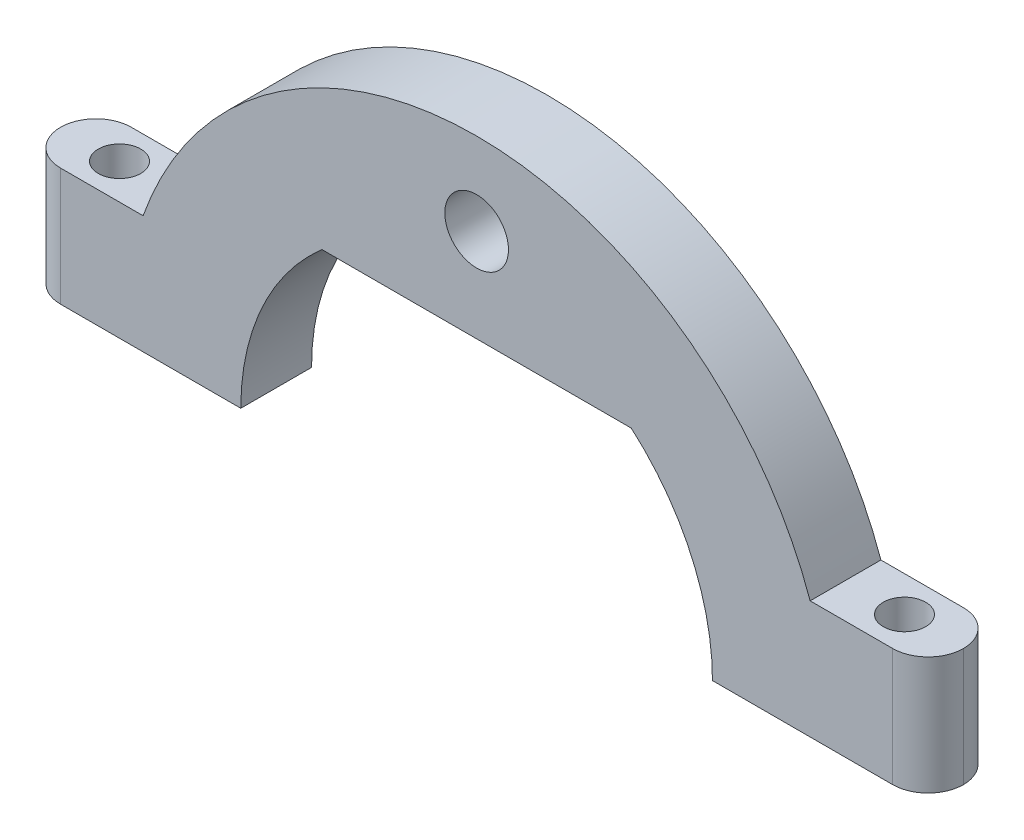
ISO-10303-21;
HEADER;
FILE_DESCRIPTION(('STEP AP214'),'2;1');
FILE_NAME('part.step','',(''),(''),'','','');
FILE_SCHEMA(('AUTOMOTIVE_DESIGN { 1 0 10303 214 1 1 1 1 }'));
ENDSEC;
DATA;
#1=APPLICATION_CONTEXT('core data for automotive mechanical design processes');
#2=APPLICATION_PROTOCOL_DEFINITION('international standard','automotive_design',2000,#1);
#3=PRODUCT_CONTEXT('',#1,'mechanical');
#4=PRODUCT('Part','Part','',(#3));
#5=PRODUCT_RELATED_PRODUCT_CATEGORY('part','',(#4));
#6=PRODUCT_DEFINITION_FORMATION('','',#4);
#7=PRODUCT_DEFINITION_CONTEXT('part definition',#1,'design');
#8=PRODUCT_DEFINITION('design','',#6,#7);
#9=PRODUCT_DEFINITION_SHAPE('','',#8);
#10=(LENGTH_UNIT() NAMED_UNIT(*) SI_UNIT(.MILLI.,.METRE.));
#11=(NAMED_UNIT(*) PLANE_ANGLE_UNIT() SI_UNIT($,.RADIAN.));
#12=(NAMED_UNIT(*) SI_UNIT($,.STERADIAN.) SOLID_ANGLE_UNIT());
#13=UNCERTAINTY_MEASURE_WITH_UNIT(LENGTH_MEASURE(1.E-05),#10,'distance_accuracy_value','');
#14=(GEOMETRIC_REPRESENTATION_CONTEXT(3) GLOBAL_UNCERTAINTY_ASSIGNED_CONTEXT((#13)) GLOBAL_UNIT_ASSIGNED_CONTEXT((#10,
#11,#12)) REPRESENTATION_CONTEXT('',''));
#15=CARTESIAN_POINT('',(0.,0.,0.));
#16=DIRECTION('',(0.,0.,1.));
#17=DIRECTION('',(1.,0.,0.));
#18=AXIS2_PLACEMENT_3D('',#15,#16,#17);
#19=CARTESIAN_POINT('',(0.,0.,0.));
#20=DIRECTION('',(0.,1.,0.));
#21=DIRECTION('',(0.,0.,1.));
#22=AXIS2_PLACEMENT_3D('',#19,#20,#21);
#23=PLANE('',#22);
#24=DIRECTION('',(0.,0.,-1.));
#25=VECTOR('',#24,1.);
#26=CARTESIAN_POINT('',(10.,0.,3.));
#27=LINE('',#26,#25);
#28=CARTESIAN_POINT('',(10.,0.,3.));
#29=VERTEX_POINT('',#28);
#30=CARTESIAN_POINT('',(10.,0.,0.));
#31=VERTEX_POINT('',#30);
#32=EDGE_CURVE('E220',#29,#31,#27,.T.);
#33=ORIENTED_EDGE('',*,*,#32,.T.);
#34=DIRECTION('',(-1.,0.,0.));
#35=VECTOR('',#34,1.);
#36=CARTESIAN_POINT('',(0.,0.,0.));
#37=LINE('',#36,#35);
#38=CARTESIAN_POINT('',(17.6421356237309,0.,0.));
#39=VERTEX_POINT('',#38);
#40=EDGE_CURVE('E218',#39,#31,#37,.T.);
#41=ORIENTED_EDGE('',*,*,#40,.F.);
#42=CARTESIAN_POINT('',(17.6421356237309,0.,1.5));
#43=DIRECTION('',(0.,1.,0.));
#44=DIRECTION('',(0.,0.,1.));
#45=AXIS2_PLACEMENT_3D('',#42,#43,#44);
#46=CIRCLE('',#45,1.5);
#47=CARTESIAN_POINT('',(19.142135623731,0.,1.5));
#48=VERTEX_POINT('',#47);
#49=EDGE_CURVE('E229',#39,#48,#46,.F.);
#50=ORIENTED_EDGE('',*,*,#49,.T.);
#51=CARTESIAN_POINT('',(17.6421356237309,0.,1.5));
#52=DIRECTION('',(0.,1.,0.));
#53=DIRECTION('',(0.,0.,1.));
#54=AXIS2_PLACEMENT_3D('',#51,#52,#53);
#55=CIRCLE('',#54,1.5);
#56=CARTESIAN_POINT('',(17.6421356237309,0.,3.));
#57=VERTEX_POINT('',#56);
#58=EDGE_CURVE('E217',#48,#57,#55,.F.);
#59=ORIENTED_EDGE('',*,*,#58,.T.);
#60=DIRECTION('',(-1.,0.,0.));
#61=VECTOR('',#60,1.);
#62=CARTESIAN_POINT('',(0.,0.,3.));
#63=LINE('',#62,#61);
#64=EDGE_CURVE('E224',#57,#29,#63,.T.);
#65=ORIENTED_EDGE('',*,*,#64,.T.);
#66=EDGE_LOOP('',(#33,#41,#50,#59,#65));
#67=FACE_BOUND('',#66,.T.);
#68=CARTESIAN_POINT('',(16.642135623731,0.,1.5));
#69=DIRECTION('',(0.,1.,0.));
#70=DIRECTION('',(0.,0.,1.));
#71=AXIS2_PLACEMENT_3D('',#68,#69,#70);
#72=CIRCLE('',#71,0.9);
#73=CARTESIAN_POINT('',(16.642135623731,0.,2.4));
#74=VERTEX_POINT('',#73);
#75=EDGE_CURVE('E45',#74,#74,#72,.F.);
#76=ORIENTED_EDGE('',*,*,#75,.F.);
#77=EDGE_LOOP('',(#76));
#78=FACE_BOUND('',#77,.T.);
#79=ADVANCED_FACE('F41',(#67,#78),#23,.F.);
#80=CARTESIAN_POINT('',(-16.642135623731,0.,1.5));
#81=DIRECTION('',(0.,1.,0.));
#82=DIRECTION('',(0.,0.,1.));
#83=AXIS2_PLACEMENT_3D('',#80,#81,#82);
#84=CIRCLE('',#83,0.9);
#85=CARTESIAN_POINT('',(-16.642135623731,0.,2.4));
#86=VERTEX_POINT('',#85);
#87=EDGE_CURVE('E223',#86,#86,#84,.T.);
#88=ORIENTED_EDGE('',*,*,#87,.T.);
#89=EDGE_LOOP('',(#88));
#90=FACE_BOUND('',#89,.T.);
#91=DIRECTION('',(0.,0.,-1.));
#92=VECTOR('',#91,1.);
#93=CARTESIAN_POINT('',(-10.,0.,3.));
#94=LINE('',#93,#92);
#95=CARTESIAN_POINT('',(-10.,0.,0.));
#96=VERTEX_POINT('',#95);
#97=CARTESIAN_POINT('',(-10.,0.,3.));
#98=VERTEX_POINT('',#97);
#99=EDGE_CURVE('E225',#96,#98,#94,.F.);
#100=ORIENTED_EDGE('',*,*,#99,.T.);
#101=CARTESIAN_POINT('',(-17.6421356237309,0.,3.));
#102=VERTEX_POINT('',#101);
#103=EDGE_CURVE('E158',#98,#102,#63,.T.);
#104=ORIENTED_EDGE('',*,*,#103,.T.);
#105=CARTESIAN_POINT('',(-17.6421356237309,0.,1.5));
#106=DIRECTION('',(0.,1.,0.));
#107=DIRECTION('',(0.,0.,1.));
#108=AXIS2_PLACEMENT_3D('',#105,#106,#107);
#109=CIRCLE('',#108,1.5);
#110=CARTESIAN_POINT('',(-19.142135623731,0.,1.5));
#111=VERTEX_POINT('',#110);
#112=EDGE_CURVE('E11',#102,#111,#109,.F.);
#113=ORIENTED_EDGE('',*,*,#112,.T.);
#114=CARTESIAN_POINT('',(-17.6421356237309,0.,1.5));
#115=DIRECTION('',(0.,1.,0.));
#116=DIRECTION('',(0.,0.,1.));
#117=AXIS2_PLACEMENT_3D('',#114,#115,#116);
#118=CIRCLE('',#117,1.5);
#119=CARTESIAN_POINT('',(-17.6421356237309,0.,0.));
#120=VERTEX_POINT('',#119);
#121=EDGE_CURVE('E50',#111,#120,#118,.F.);
#122=ORIENTED_EDGE('',*,*,#121,.T.);
#123=EDGE_CURVE('E221',#96,#120,#37,.T.);
#124=ORIENTED_EDGE('',*,*,#123,.F.);
#125=EDGE_LOOP('',(#100,#104,#113,#122,#124));
#126=FACE_BOUND('',#125,.T.);
#127=ADVANCED_FACE('F43',(#90,#126),#23,.F.);
#128=CARTESIAN_POINT('',(0.,5.,3.));
#129=DIRECTION('',(0.,1.,0.));
#130=DIRECTION('',(0.,0.,1.));
#131=AXIS2_PLACEMENT_3D('',#128,#129,#130);
#132=PLANE('',#131);
#133=CARTESIAN_POINT('',(16.6421356237309,5.,1.5));
#134=DIRECTION('',(0.,1.,0.));
#135=DIRECTION('',(0.,0.,1.));
#136=AXIS2_PLACEMENT_3D('',#133,#134,#135);
#137=CIRCLE('',#136,0.9);
#138=CARTESIAN_POINT('',(16.6421356237309,5.,2.4));
#139=VERTEX_POINT('',#138);
#140=EDGE_CURVE('E176',#139,#139,#137,.T.);
#141=ORIENTED_EDGE('',*,*,#140,.F.);
#142=EDGE_LOOP('',(#141));
#143=FACE_BOUND('',#142,.T.);
#144=DIRECTION('',(1.,0.,0.));
#145=VECTOR('',#144,1.);
#146=CARTESIAN_POINT('',(0.,5.,3.));
#147=LINE('',#146,#145);
#148=CARTESIAN_POINT('',(14.142135623731,5.,3.));
#149=VERTEX_POINT('',#148);
#150=CARTESIAN_POINT('',(17.6421356237309,5.,3.));
#151=VERTEX_POINT('',#150);
#152=EDGE_CURVE('E153',#149,#151,#147,.T.);
#153=ORIENTED_EDGE('',*,*,#152,.T.);
#154=CARTESIAN_POINT('',(17.6421356237309,5.,1.5));
#155=DIRECTION('',(0.,1.,0.));
#156=DIRECTION('',(0.,0.,1.));
#157=AXIS2_PLACEMENT_3D('',#154,#155,#156);
#158=CIRCLE('',#157,1.5);
#159=CARTESIAN_POINT('',(19.142135623731,5.,1.5));
#160=VERTEX_POINT('',#159);
#161=EDGE_CURVE('E199',#151,#160,#158,.T.);
#162=ORIENTED_EDGE('',*,*,#161,.T.);
#163=CARTESIAN_POINT('',(17.6421356237309,5.,1.5));
#164=DIRECTION('',(0.,1.,0.));
#165=DIRECTION('',(0.,0.,1.));
#166=AXIS2_PLACEMENT_3D('',#163,#164,#165);
#167=CIRCLE('',#166,1.5);
#168=CARTESIAN_POINT('',(17.6421356237309,5.,0.));
#169=VERTEX_POINT('',#168);
#170=EDGE_CURVE('E197',#160,#169,#167,.T.);
#171=ORIENTED_EDGE('',*,*,#170,.T.);
#172=DIRECTION('',(1.,0.,0.));
#173=VECTOR('',#172,1.);
#174=CARTESIAN_POINT('',(0.,5.,0.));
#175=LINE('',#174,#173);
#176=CARTESIAN_POINT('',(14.142135623731,5.,0.));
#177=VERTEX_POINT('',#176);
#178=EDGE_CURVE('E179',#177,#169,#175,.T.);
#179=ORIENTED_EDGE('',*,*,#178,.F.);
#180=DIRECTION('',(0.,0.,-1.));
#181=VECTOR('',#180,1.);
#182=CARTESIAN_POINT('',(14.142135623731,5.,3.));
#183=LINE('',#182,#181);
#184=EDGE_CURVE('E188',#149,#177,#183,.T.);
#185=ORIENTED_EDGE('',*,*,#184,.F.);
#186=EDGE_LOOP('',(#153,#162,#171,#179,#185));
#187=FACE_BOUND('',#186,.T.);
#188=ADVANCED_FACE('F270',(#143,#187),#132,.T.);
#189=CARTESIAN_POINT('',(0.,0.,3.));
#190=DIRECTION('',(0.,0.,-1.));
#191=DIRECTION('',(-1.,0.,0.));
#192=AXIS2_PLACEMENT_3D('',#189,#190,#191);
#193=CYLINDRICAL_SURFACE('',#192,15.);
#194=CARTESIAN_POINT('',(0.,0.,0.));
#195=DIRECTION('',(0.,0.,1.));
#196=DIRECTION('',(1.,0.,0.));
#197=AXIS2_PLACEMENT_3D('',#194,#195,#196);
#198=CIRCLE('',#197,15.);
#199=CARTESIAN_POINT('',(-14.142135623731,5.,0.));
#200=VERTEX_POINT('',#199);
#201=EDGE_CURVE('E180',#177,#200,#198,.T.);
#202=ORIENTED_EDGE('',*,*,#201,.T.);
#203=DIRECTION('',(0.,0.,-1.));
#204=VECTOR('',#203,1.);
#205=CARTESIAN_POINT('',(-14.142135623731,5.,3.));
#206=LINE('',#205,#204);
#207=CARTESIAN_POINT('',(-14.142135623731,5.,3.));
#208=VERTEX_POINT('',#207);
#209=EDGE_CURVE('E143',#208,#200,#206,.T.);
#210=ORIENTED_EDGE('',*,*,#209,.F.);
#211=CARTESIAN_POINT('',(0.,0.,3.));
#212=DIRECTION('',(0.,0.,1.));
#213=DIRECTION('',(1.,0.,0.));
#214=AXIS2_PLACEMENT_3D('',#211,#212,#213);
#215=CIRCLE('',#214,15.);
#216=EDGE_CURVE('E167',#149,#208,#215,.T.);
#217=ORIENTED_EDGE('',*,*,#216,.F.);
#218=ORIENTED_EDGE('',*,*,#184,.T.);
#219=EDGE_LOOP('',(#202,#210,#217,#218));
#220=FACE_BOUND('',#219,.T.);
#221=ADVANCED_FACE('F311',(#220),#193,.T.);
#222=CARTESIAN_POINT('',(0.,5.,3.));
#223=DIRECTION('',(0.,-1.,0.));
#224=DIRECTION('',(0.,0.,-1.));
#225=AXIS2_PLACEMENT_3D('',#222,#223,#224);
#226=PLANE('',#225);
#227=CARTESIAN_POINT('',(-16.6421356237309,5.,1.5));
#228=DIRECTION('',(0.,-1.,0.));
#229=DIRECTION('',(0.,0.,-1.));
#230=AXIS2_PLACEMENT_3D('',#227,#228,#229);
#231=CIRCLE('',#230,0.9);
#232=CARTESIAN_POINT('',(-16.6421356237309,5.,0.6));
#233=VERTEX_POINT('',#232);
#234=EDGE_CURVE('E164',#233,#233,#231,.F.);
#235=ORIENTED_EDGE('',*,*,#234,.F.);
#236=EDGE_LOOP('',(#235));
#237=FACE_BOUND('',#236,.T.);
#238=CARTESIAN_POINT('',(-17.6421356237309,5.,1.5));
#239=DIRECTION('',(0.,-1.,0.));
#240=DIRECTION('',(0.,0.,-1.));
#241=AXIS2_PLACEMENT_3D('',#238,#239,#240);
#242=CIRCLE('',#241,1.5);
#243=CARTESIAN_POINT('',(-17.6421356237309,5.,0.));
#244=VERTEX_POINT('',#243);
#245=CARTESIAN_POINT('',(-19.142135623731,5.,1.5));
#246=VERTEX_POINT('',#245);
#247=EDGE_CURVE('E207',#244,#246,#242,.F.);
#248=ORIENTED_EDGE('',*,*,#247,.T.);
#249=CARTESIAN_POINT('',(-17.6421356237309,5.,1.5));
#250=DIRECTION('',(0.,-1.,0.));
#251=DIRECTION('',(0.,0.,-1.));
#252=AXIS2_PLACEMENT_3D('',#249,#250,#251);
#253=CIRCLE('',#252,1.5);
#254=CARTESIAN_POINT('',(-17.6421356237309,5.,3.));
#255=VERTEX_POINT('',#254);
#256=EDGE_CURVE('E209',#246,#255,#253,.F.);
#257=ORIENTED_EDGE('',*,*,#256,.T.);
#258=DIRECTION('',(-1.,0.,0.));
#259=VECTOR('',#258,1.);
#260=CARTESIAN_POINT('',(0.,5.,3.));
#261=LINE('',#260,#259);
#262=EDGE_CURVE('E169',#208,#255,#261,.T.);
#263=ORIENTED_EDGE('',*,*,#262,.F.);
#264=ORIENTED_EDGE('',*,*,#209,.T.);
#265=DIRECTION('',(-1.,0.,0.));
#266=VECTOR('',#265,1.);
#267=CARTESIAN_POINT('',(0.,5.,0.));
#268=LINE('',#267,#266);
#269=EDGE_CURVE('E162',#200,#244,#268,.T.);
#270=ORIENTED_EDGE('',*,*,#269,.T.);
#271=EDGE_LOOP('',(#248,#257,#263,#264,#270));
#272=FACE_BOUND('',#271,.T.);
#273=ADVANCED_FACE('F285',(#237,#272),#226,.F.);
#274=CARTESIAN_POINT('',(0.,0.,3.));
#275=DIRECTION('',(0.,0.,-1.));
#276=DIRECTION('',(-1.,0.,0.));
#277=AXIS2_PLACEMENT_3D('',#274,#275,#276);
#278=CYLINDRICAL_SURFACE('',#277,10.);
#279=ORIENTED_EDGE('',*,*,#32,.F.);
#280=CARTESIAN_POINT('',(0.,0.,3.));
#281=DIRECTION('',(0.,0.,1.));
#282=DIRECTION('',(1.,0.,0.));
#283=AXIS2_PLACEMENT_3D('',#280,#281,#282);
#284=CIRCLE('',#283,10.);
#285=CARTESIAN_POINT('',(6.55724789831832,7.55,3.));
#286=VERTEX_POINT('',#285);
#287=EDGE_CURVE('E160',#29,#286,#284,.T.);
#288=ORIENTED_EDGE('',*,*,#287,.T.);
#289=DIRECTION('',(0.,0.,-1.));
#290=VECTOR('',#289,1.);
#291=CARTESIAN_POINT('',(6.55724789831832,7.55,3.));
#292=LINE('',#291,#290);
#293=CARTESIAN_POINT('',(6.55724789831832,7.55,0.));
#294=VERTEX_POINT('',#293);
#295=EDGE_CURVE('E144',#286,#294,#292,.T.);
#296=ORIENTED_EDGE('',*,*,#295,.T.);
#297=CARTESIAN_POINT('',(0.,0.,0.));
#298=DIRECTION('',(0.,0.,1.));
#299=DIRECTION('',(1.,0.,0.));
#300=AXIS2_PLACEMENT_3D('',#297,#298,#299);
#301=CIRCLE('',#300,10.);
#302=EDGE_CURVE('E174',#31,#294,#301,.T.);
#303=ORIENTED_EDGE('',*,*,#302,.F.);
#304=EDGE_LOOP('',(#279,#288,#296,#303));
#305=FACE_BOUND('',#304,.T.);
#306=ADVANCED_FACE('F304',(#305),#278,.F.);
#307=ORIENTED_EDGE('',*,*,#99,.F.);
#308=CARTESIAN_POINT('',(-6.55724789831832,7.55,0.));
#309=VERTEX_POINT('',#308);
#310=EDGE_CURVE('E139',#309,#96,#301,.T.);
#311=ORIENTED_EDGE('',*,*,#310,.F.);
#312=DIRECTION('',(0.,0.,-1.));
#313=VECTOR('',#312,1.);
#314=CARTESIAN_POINT('',(-6.55724789831832,7.55,3.));
#315=LINE('',#314,#313);
#316=CARTESIAN_POINT('',(-6.55724789831832,7.55,3.));
#317=VERTEX_POINT('',#316);
#318=EDGE_CURVE('E132',#317,#309,#315,.T.);
#319=ORIENTED_EDGE('',*,*,#318,.F.);
#320=EDGE_CURVE('E137',#317,#98,#284,.T.);
#321=ORIENTED_EDGE('',*,*,#320,.T.);
#322=EDGE_LOOP('',(#307,#311,#319,#321));
#323=FACE_BOUND('',#322,.T.);
#324=ADVANCED_FACE('F135',(#323),#278,.F.);
#325=CARTESIAN_POINT('',(0.,7.55,3.));
#326=DIRECTION('',(0.,1.,0.));
#327=DIRECTION('',(0.,0.,1.));
#328=AXIS2_PLACEMENT_3D('',#325,#326,#327);
#329=PLANE('',#328);
#330=DIRECTION('',(1.,0.,0.));
#331=VECTOR('',#330,1.);
#332=CARTESIAN_POINT('',(0.,7.55,0.));
#333=LINE('',#332,#331);
#334=EDGE_CURVE('E177',#309,#294,#333,.T.);
#335=ORIENTED_EDGE('',*,*,#334,.T.);
#336=ORIENTED_EDGE('',*,*,#295,.F.);
#337=DIRECTION('',(1.,0.,0.));
#338=VECTOR('',#337,1.);
#339=CARTESIAN_POINT('',(0.,7.55,3.));
#340=LINE('',#339,#338);
#341=EDGE_CURVE('E148',#317,#286,#340,.T.);
#342=ORIENTED_EDGE('',*,*,#341,.F.);
#343=ORIENTED_EDGE('',*,*,#318,.T.);
#344=EDGE_LOOP('',(#335,#336,#342,#343));
#345=FACE_BOUND('',#344,.T.);
#346=ADVANCED_FACE('F149',(#345),#329,.F.);
#347=CARTESIAN_POINT('',(0.,0.,3.));
#348=DIRECTION('',(0.,0.,1.));
#349=DIRECTION('',(1.,0.,0.));
#350=AXIS2_PLACEMENT_3D('',#347,#348,#349);
#351=PLANE('',#350);
#352=ORIENTED_EDGE('',*,*,#64,.F.);
#353=DIRECTION('',(0.,-1.,0.));
#354=VECTOR('',#353,1.);
#355=CARTESIAN_POINT('',(17.6421356237309,0.,3.));
#356=LINE('',#355,#354);
#357=EDGE_CURVE('E195',#57,#151,#356,.F.);
#358=ORIENTED_EDGE('',*,*,#357,.T.);
#359=ORIENTED_EDGE('',*,*,#152,.F.);
#360=ORIENTED_EDGE('',*,*,#216,.T.);
#361=ORIENTED_EDGE('',*,*,#262,.T.);
#362=DIRECTION('',(0.,-1.,0.));
#363=VECTOR('',#362,1.);
#364=CARTESIAN_POINT('',(-17.6421356237309,-5.,3.));
#365=LINE('',#364,#363);
#366=EDGE_CURVE('E190',#255,#102,#365,.T.);
#367=ORIENTED_EDGE('',*,*,#366,.T.);
#368=ORIENTED_EDGE('',*,*,#103,.F.);
#369=ORIENTED_EDGE('',*,*,#320,.F.);
#370=ORIENTED_EDGE('',*,*,#341,.T.);
#371=ORIENTED_EDGE('',*,*,#287,.F.);
#372=EDGE_LOOP('',(#352,#358,#359,#360,#361,#367,#368,#369,#370,#371));
#373=FACE_BOUND('',#372,.T.);
#374=CARTESIAN_POINT('',(0.,11.5,3.));
#375=DIRECTION('',(0.,0.,1.));
#376=DIRECTION('',(1.,0.,0.));
#377=AXIS2_PLACEMENT_3D('',#374,#375,#376);
#378=CIRCLE('',#377,1.35);
#379=CARTESIAN_POINT('',(1.35,11.5,3.));
#380=VERTEX_POINT('',#379);
#381=EDGE_CURVE('E213',#380,#380,#378,.T.);
#382=ORIENTED_EDGE('',*,*,#381,.F.);
#383=EDGE_LOOP('',(#382));
#384=FACE_BOUND('',#383,.T.);
#385=ADVANCED_FACE('F155',(#373,#384),#351,.T.);
#386=CARTESIAN_POINT('',(0.,0.,0.));
#387=DIRECTION('',(0.,0.,1.));
#388=DIRECTION('',(1.,0.,0.));
#389=AXIS2_PLACEMENT_3D('',#386,#387,#388);
#390=PLANE('',#389);
#391=CARTESIAN_POINT('',(0.,11.5,0.));
#392=DIRECTION('',(0.,0.,1.));
#393=DIRECTION('',(1.,0.,0.));
#394=AXIS2_PLACEMENT_3D('',#391,#392,#393);
#395=CIRCLE('',#394,1.35);
#396=CARTESIAN_POINT('',(1.35,11.5,0.));
#397=VERTEX_POINT('',#396);
#398=EDGE_CURVE('E247',#397,#397,#395,.T.);
#399=ORIENTED_EDGE('',*,*,#398,.T.);
#400=EDGE_LOOP('',(#399));
#401=FACE_BOUND('',#400,.T.);
#402=DIRECTION('',(0.,-1.,0.));
#403=VECTOR('',#402,1.);
#404=CARTESIAN_POINT('',(17.6421356237309,-5.,0.));
#405=LINE('',#404,#403);
#406=EDGE_CURVE('E204',#169,#39,#405,.T.);
#407=ORIENTED_EDGE('',*,*,#406,.T.);
#408=ORIENTED_EDGE('',*,*,#40,.T.);
#409=ORIENTED_EDGE('',*,*,#302,.T.);
#410=ORIENTED_EDGE('',*,*,#334,.F.);
#411=ORIENTED_EDGE('',*,*,#310,.T.);
#412=ORIENTED_EDGE('',*,*,#123,.T.);
#413=DIRECTION('',(0.,-1.,0.));
#414=VECTOR('',#413,1.);
#415=CARTESIAN_POINT('',(-17.6421356237309,0.,0.));
#416=LINE('',#415,#414);
#417=EDGE_CURVE('E202',#120,#244,#416,.F.);
#418=ORIENTED_EDGE('',*,*,#417,.T.);
#419=ORIENTED_EDGE('',*,*,#269,.F.);
#420=ORIENTED_EDGE('',*,*,#201,.F.);
#421=ORIENTED_EDGE('',*,*,#178,.T.);
#422=EDGE_LOOP('',(#407,#408,#409,#410,#411,#412,#418,#419,#420,#421));
#423=FACE_BOUND('',#422,.T.);
#424=ADVANCED_FACE('F256',(#401,#423),#390,.F.);
#425=CARTESIAN_POINT('',(16.6421356237309,15.,1.5));
#426=DIRECTION('',(0.,-1.,0.));
#427=DIRECTION('',(1.,0.,0.));
#428=AXIS2_PLACEMENT_3D('',#425,#426,#427);
#429=CYLINDRICAL_SURFACE('',#428,0.9);
#430=ORIENTED_EDGE('',*,*,#75,.T.);
#431=EDGE_LOOP('',(#430));
#432=FACE_BOUND('',#431,.T.);
#433=ORIENTED_EDGE('',*,*,#140,.T.);
#434=EDGE_LOOP('',(#433));
#435=FACE_BOUND('',#434,.T.);
#436=ADVANCED_FACE('F242',(#432,#435),#429,.F.);
#437=CARTESIAN_POINT('',(-16.6421356237309,15.,1.5));
#438=DIRECTION('',(0.,-1.,0.));
#439=DIRECTION('',(1.,0.,0.));
#440=AXIS2_PLACEMENT_3D('',#437,#438,#439);
#441=CYLINDRICAL_SURFACE('',#440,0.9);
#442=ORIENTED_EDGE('',*,*,#87,.F.);
#443=EDGE_LOOP('',(#442));
#444=FACE_BOUND('',#443,.T.);
#445=ORIENTED_EDGE('',*,*,#234,.T.);
#446=EDGE_LOOP('',(#445));
#447=FACE_BOUND('',#446,.T.);
#448=ADVANCED_FACE('F238',(#444,#447),#441,.F.);
#449=CARTESIAN_POINT('',(0.,11.5,0.));
#450=DIRECTION('',(0.,0.,1.));
#451=DIRECTION('',(1.,0.,0.));
#452=AXIS2_PLACEMENT_3D('',#449,#450,#451);
#453=CYLINDRICAL_SURFACE('',#452,1.35);
#454=ORIENTED_EDGE('',*,*,#398,.F.);
#455=EDGE_LOOP('',(#454));
#456=FACE_BOUND('',#455,.T.);
#457=ORIENTED_EDGE('',*,*,#381,.T.);
#458=EDGE_LOOP('',(#457));
#459=FACE_BOUND('',#458,.T.);
#460=ADVANCED_FACE('F241',(#456,#459),#453,.F.);
#461=CARTESIAN_POINT('',(17.6421356237309,0.,1.5));
#462=DIRECTION('',(0.,1.,0.));
#463=DIRECTION('',(0.,0.,1.));
#464=AXIS2_PLACEMENT_3D('',#461,#462,#463);
#465=CYLINDRICAL_SURFACE('',#464,1.5);
#466=ORIENTED_EDGE('',*,*,#49,.F.);
#467=ORIENTED_EDGE('',*,*,#406,.F.);
#468=ORIENTED_EDGE('',*,*,#170,.F.);
#469=DIRECTION('',(0.,-1.,0.));
#470=VECTOR('',#469,1.);
#471=CARTESIAN_POINT('',(19.142135623731,5.,1.5));
#472=LINE('',#471,#470);
#473=EDGE_CURVE('E211',#48,#160,#472,.F.);
#474=ORIENTED_EDGE('',*,*,#473,.F.);
#475=EDGE_LOOP('',(#466,#467,#468,#474));
#476=FACE_BOUND('',#475,.T.);
#477=ADVANCED_FACE('F298',(#476),#465,.T.);
#478=CARTESIAN_POINT('',(17.6421356237309,0.,1.5));
#479=DIRECTION('',(0.,-1.,0.));
#480=DIRECTION('',(0.,0.,-1.));
#481=AXIS2_PLACEMENT_3D('',#478,#479,#480);
#482=CYLINDRICAL_SURFACE('',#481,1.5);
#483=ORIENTED_EDGE('',*,*,#58,.F.);
#484=ORIENTED_EDGE('',*,*,#473,.T.);
#485=ORIENTED_EDGE('',*,*,#161,.F.);
#486=ORIENTED_EDGE('',*,*,#357,.F.);
#487=EDGE_LOOP('',(#483,#484,#485,#486));
#488=FACE_BOUND('',#487,.T.);
#489=ADVANCED_FACE('F301',(#488),#482,.T.);
#490=CARTESIAN_POINT('',(-17.6421356237309,0.,1.5));
#491=DIRECTION('',(0.,-1.,0.));
#492=DIRECTION('',(0.,0.,-1.));
#493=AXIS2_PLACEMENT_3D('',#490,#491,#492);
#494=CYLINDRICAL_SURFACE('',#493,1.5);
#495=ORIENTED_EDGE('',*,*,#121,.F.);
#496=DIRECTION('',(0.,-1.,0.));
#497=VECTOR('',#496,1.);
#498=CARTESIAN_POINT('',(-19.142135623731,0.,1.5));
#499=LINE('',#498,#497);
#500=EDGE_CURVE('E214',#246,#111,#499,.T.);
#501=ORIENTED_EDGE('',*,*,#500,.F.);
#502=ORIENTED_EDGE('',*,*,#247,.F.);
#503=ORIENTED_EDGE('',*,*,#417,.F.);
#504=EDGE_LOOP('',(#495,#501,#502,#503));
#505=FACE_BOUND('',#504,.T.);
#506=ADVANCED_FACE('F282',(#505),#494,.T.);
#507=CARTESIAN_POINT('',(-17.6421356237309,0.,1.5));
#508=DIRECTION('',(0.,1.,0.));
#509=DIRECTION('',(0.,0.,1.));
#510=AXIS2_PLACEMENT_3D('',#507,#508,#509);
#511=CYLINDRICAL_SURFACE('',#510,1.5);
#512=ORIENTED_EDGE('',*,*,#112,.F.);
#513=ORIENTED_EDGE('',*,*,#366,.F.);
#514=ORIENTED_EDGE('',*,*,#256,.F.);
#515=ORIENTED_EDGE('',*,*,#500,.T.);
#516=EDGE_LOOP('',(#512,#513,#514,#515));
#517=FACE_BOUND('',#516,.T.);
#518=ADVANCED_FACE('F271',(#517),#511,.T.);
#519=CLOSED_SHELL('',(#79,#127,#188,#221,#273,#306,#324,#346,#385,#424,#436,#448,#460,#477,#489,
#506,#518));
#520=MANIFOLD_SOLID_BREP('B2',#519);
#521=ADVANCED_BREP_SHAPE_REPRESENTATION('',(#18,#520),#14);
#522=SHAPE_DEFINITION_REPRESENTATION(#9,#521);
ENDSEC;
END-ISO-10303-21;
